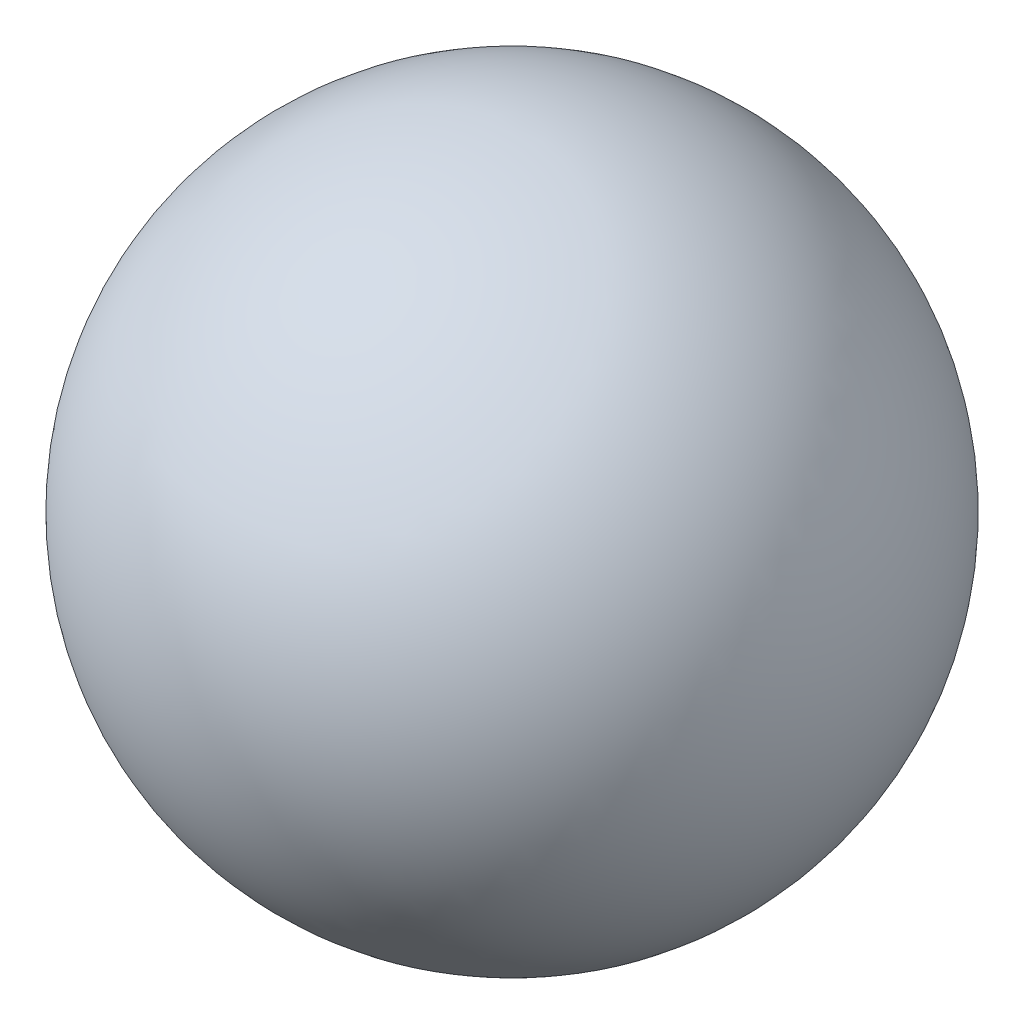
ISO-10303-21;
HEADER;
FILE_DESCRIPTION(('STEP AP214'),'2;1');
FILE_NAME('part.step','',(''),(''),'','','');
FILE_SCHEMA(('AUTOMOTIVE_DESIGN { 1 0 10303 214 1 1 1 1 }'));
ENDSEC;
DATA;
#1=APPLICATION_CONTEXT('core data for automotive mechanical design processes');
#2=APPLICATION_PROTOCOL_DEFINITION('international standard','automotive_design',2000,#1);
#3=PRODUCT_CONTEXT('',#1,'mechanical');
#4=PRODUCT('Part','Part','',(#3));
#5=PRODUCT_RELATED_PRODUCT_CATEGORY('part','',(#4));
#6=PRODUCT_DEFINITION_FORMATION('','',#4);
#7=PRODUCT_DEFINITION_CONTEXT('part definition',#1,'design');
#8=PRODUCT_DEFINITION('design','',#6,#7);
#9=PRODUCT_DEFINITION_SHAPE('','',#8);
#10=(LENGTH_UNIT() NAMED_UNIT(*) SI_UNIT(.MILLI.,.METRE.));
#11=(NAMED_UNIT(*) PLANE_ANGLE_UNIT() SI_UNIT($,.RADIAN.));
#12=(NAMED_UNIT(*) SI_UNIT($,.STERADIAN.) SOLID_ANGLE_UNIT());
#13=UNCERTAINTY_MEASURE_WITH_UNIT(LENGTH_MEASURE(1.E-05),#10,'distance_accuracy_value','');
#14=(GEOMETRIC_REPRESENTATION_CONTEXT(3) GLOBAL_UNCERTAINTY_ASSIGNED_CONTEXT((#13)) GLOBAL_UNIT_ASSIGNED_CONTEXT((#10,
#11,#12)) REPRESENTATION_CONTEXT('',''));
#15=CARTESIAN_POINT('',(0.,0.,0.));
#16=DIRECTION('',(0.,0.,1.));
#17=DIRECTION('',(1.,0.,0.));
#18=AXIS2_PLACEMENT_3D('',#15,#16,#17);
#19=CARTESIAN_POINT('',(0.,0.,0.));
#20=DIRECTION('',(0.,1.,0.));
#21=DIRECTION('',(1.,0.,0.));
#22=AXIS2_PLACEMENT_3D('',#19,#20,#21);
#23=SPHERICAL_SURFACE('',#22,304.8);
#24=CARTESIAN_POINT('',(0.,304.8,0.));
#25=VERTEX_POINT('',#24);
#26=VERTEX_LOOP('',#25);
#27=FACE_BOUND('',#26,.T.);
#28=ADVANCED_FACE('F30',(#27),#23,.T.);
#29=CLOSED_SHELL('',(#28));
#30=CARTESIAN_POINT('',(0.,0.,0.));
#31=DIRECTION('',(0.,1.,0.));
#32=DIRECTION('',(1.,0.,0.));
#33=AXIS2_PLACEMENT_3D('',#30,#31,#32);
#34=SPHERICAL_SURFACE('',#33,302.26);
#35=CARTESIAN_POINT('',(0.,302.26,0.));
#36=VERTEX_POINT('',#35);
#37=VERTEX_LOOP('',#36);
#38=FACE_BOUND('',#37,.T.);
#39=ADVANCED_FACE('F32',(#38),#34,.F.);
#40=CLOSED_SHELL('',(#39));
#41=ORIENTED_CLOSED_SHELL('',*,#40,.T.);
#42=BREP_WITH_VOIDS('B2',#29,(#41));
#43=ADVANCED_BREP_SHAPE_REPRESENTATION('',(#18,#42),#14);
#44=SHAPE_DEFINITION_REPRESENTATION(#9,#43);
ENDSEC;
END-ISO-10303-21;
